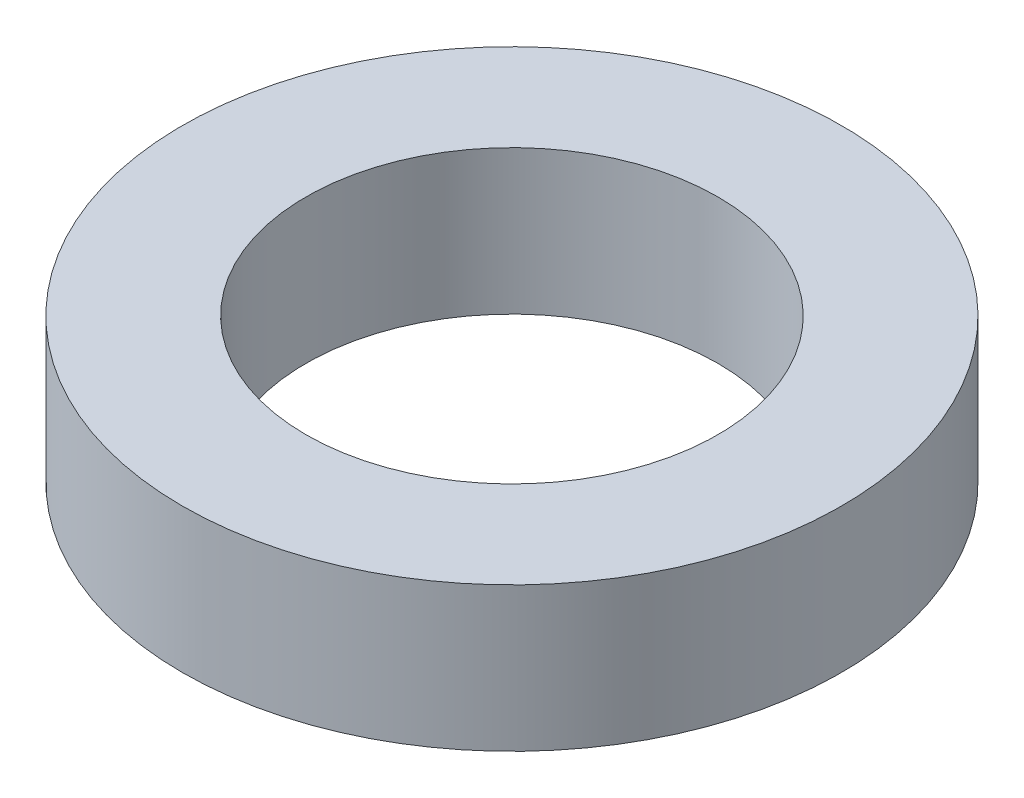
ISO-10303-21;
HEADER;
FILE_DESCRIPTION(('STEP AP214'),'2;1');
FILE_NAME('part.step','',(''),(''),'','','');
FILE_SCHEMA(('AUTOMOTIVE_DESIGN { 1 0 10303 214 1 1 1 1 }'));
ENDSEC;
DATA;
#1=APPLICATION_CONTEXT('core data for automotive mechanical design processes');
#2=APPLICATION_PROTOCOL_DEFINITION('international standard','automotive_design',2000,#1);
#3=PRODUCT_CONTEXT('',#1,'mechanical');
#4=PRODUCT('Part','Part','',(#3));
#5=PRODUCT_RELATED_PRODUCT_CATEGORY('part','',(#4));
#6=PRODUCT_DEFINITION_FORMATION('','',#4);
#7=PRODUCT_DEFINITION_CONTEXT('part definition',#1,'design');
#8=PRODUCT_DEFINITION('design','',#6,#7);
#9=PRODUCT_DEFINITION_SHAPE('','',#8);
#10=(LENGTH_UNIT() NAMED_UNIT(*) SI_UNIT(.MILLI.,.METRE.));
#11=(NAMED_UNIT(*) PLANE_ANGLE_UNIT() SI_UNIT($,.RADIAN.));
#12=(NAMED_UNIT(*) SI_UNIT($,.STERADIAN.) SOLID_ANGLE_UNIT());
#13=UNCERTAINTY_MEASURE_WITH_UNIT(LENGTH_MEASURE(1.E-05),#10,'distance_accuracy_value','');
#14=(GEOMETRIC_REPRESENTATION_CONTEXT(3) GLOBAL_UNCERTAINTY_ASSIGNED_CONTEXT((#13)) GLOBAL_UNIT_ASSIGNED_CONTEXT((#10,
#11,#12)) REPRESENTATION_CONTEXT('',''));
#15=CARTESIAN_POINT('',(0.,0.,0.));
#16=DIRECTION('',(0.,0.,1.));
#17=DIRECTION('',(1.,0.,0.));
#18=AXIS2_PLACEMENT_3D('',#15,#16,#17);
#19=CARTESIAN_POINT('',(0.,3.5,0.));
#20=DIRECTION('',(0.,1.,0.));
#21=DIRECTION('',(0.,0.,1.));
#22=AXIS2_PLACEMENT_3D('',#19,#20,#21);
#23=PLANE('',#22);
#24=CARTESIAN_POINT('',(0.,3.5,0.));
#25=DIRECTION('',(0.,1.,0.));
#26=DIRECTION('',(0.,0.,1.));
#27=AXIS2_PLACEMENT_3D('',#24,#25,#26);
#28=CIRCLE('',#27,16.);
#29=CARTESIAN_POINT('',(0.,3.5,16.));
#30=VERTEX_POINT('',#29);
#31=EDGE_CURVE('E10',#30,#30,#28,.T.);
#32=ORIENTED_EDGE('',*,*,#31,.T.);
#33=EDGE_LOOP('',(#32));
#34=FACE_BOUND('',#33,.T.);
#35=CARTESIAN_POINT('',(0.,3.5,0.));
#36=DIRECTION('',(0.,1.,0.));
#37=DIRECTION('',(0.,0.,1.));
#38=AXIS2_PLACEMENT_3D('',#35,#36,#37);
#39=CIRCLE('',#38,10.);
#40=CARTESIAN_POINT('',(0.,3.5,10.));
#41=VERTEX_POINT('',#40);
#42=EDGE_CURVE('E55',#41,#41,#39,.T.);
#43=ORIENTED_EDGE('',*,*,#42,.F.);
#44=EDGE_LOOP('',(#43));
#45=FACE_BOUND('',#44,.T.);
#46=ADVANCED_FACE('F41',(#34,#45),#23,.T.);
#47=CARTESIAN_POINT('',(0.,-3.5,0.));
#48=DIRECTION('',(0.,1.,0.));
#49=DIRECTION('',(0.,0.,1.));
#50=AXIS2_PLACEMENT_3D('',#47,#48,#49);
#51=PLANE('',#50);
#52=CARTESIAN_POINT('',(0.,-3.5,0.));
#53=DIRECTION('',(0.,1.,0.));
#54=DIRECTION('',(0.,0.,1.));
#55=AXIS2_PLACEMENT_3D('',#52,#53,#54);
#56=CIRCLE('',#55,16.);
#57=CARTESIAN_POINT('',(0.,-3.5,16.));
#58=VERTEX_POINT('',#57);
#59=EDGE_CURVE('E44',#58,#58,#56,.T.);
#60=ORIENTED_EDGE('',*,*,#59,.F.);
#61=EDGE_LOOP('',(#60));
#62=FACE_BOUND('',#61,.T.);
#63=CARTESIAN_POINT('',(0.,-3.5,0.));
#64=DIRECTION('',(0.,1.,0.));
#65=DIRECTION('',(0.,0.,1.));
#66=AXIS2_PLACEMENT_3D('',#63,#64,#65);
#67=CIRCLE('',#66,10.);
#68=CARTESIAN_POINT('',(0.,-3.5,10.));
#69=VERTEX_POINT('',#68);
#70=EDGE_CURVE('E53',#69,#69,#67,.T.);
#71=ORIENTED_EDGE('',*,*,#70,.T.);
#72=EDGE_LOOP('',(#71));
#73=FACE_BOUND('',#72,.T.);
#74=ADVANCED_FACE('F61',(#62,#73),#51,.F.);
#75=CARTESIAN_POINT('',(0.,3.5,0.));
#76=DIRECTION('',(0.,-1.,0.));
#77=DIRECTION('',(0.,0.,-1.));
#78=AXIS2_PLACEMENT_3D('',#75,#76,#77);
#79=CYLINDRICAL_SURFACE('',#78,16.);
#80=ORIENTED_EDGE('',*,*,#31,.F.);
#81=EDGE_LOOP('',(#80));
#82=FACE_BOUND('',#81,.T.);
#83=ORIENTED_EDGE('',*,*,#59,.T.);
#84=EDGE_LOOP('',(#83));
#85=FACE_BOUND('',#84,.T.);
#86=ADVANCED_FACE('F43',(#82,#85),#79,.T.);
#87=CARTESIAN_POINT('',(0.,3.5,0.));
#88=DIRECTION('',(0.,-1.,0.));
#89=DIRECTION('',(0.,0.,-1.));
#90=AXIS2_PLACEMENT_3D('',#87,#88,#89);
#91=CYLINDRICAL_SURFACE('',#90,10.);
#92=ORIENTED_EDGE('',*,*,#42,.T.);
#93=EDGE_LOOP('',(#92));
#94=FACE_BOUND('',#93,.T.);
#95=ORIENTED_EDGE('',*,*,#70,.F.);
#96=EDGE_LOOP('',(#95));
#97=FACE_BOUND('',#96,.T.);
#98=ADVANCED_FACE('F58',(#94,#97),#91,.F.);
#99=CLOSED_SHELL('',(#46,#74,#86,#98));
#100=MANIFOLD_SOLID_BREP('B2',#99);
#101=ADVANCED_BREP_SHAPE_REPRESENTATION('',(#18,#100),#14);
#102=SHAPE_DEFINITION_REPRESENTATION(#9,#101);
ENDSEC;
END-ISO-10303-21;
